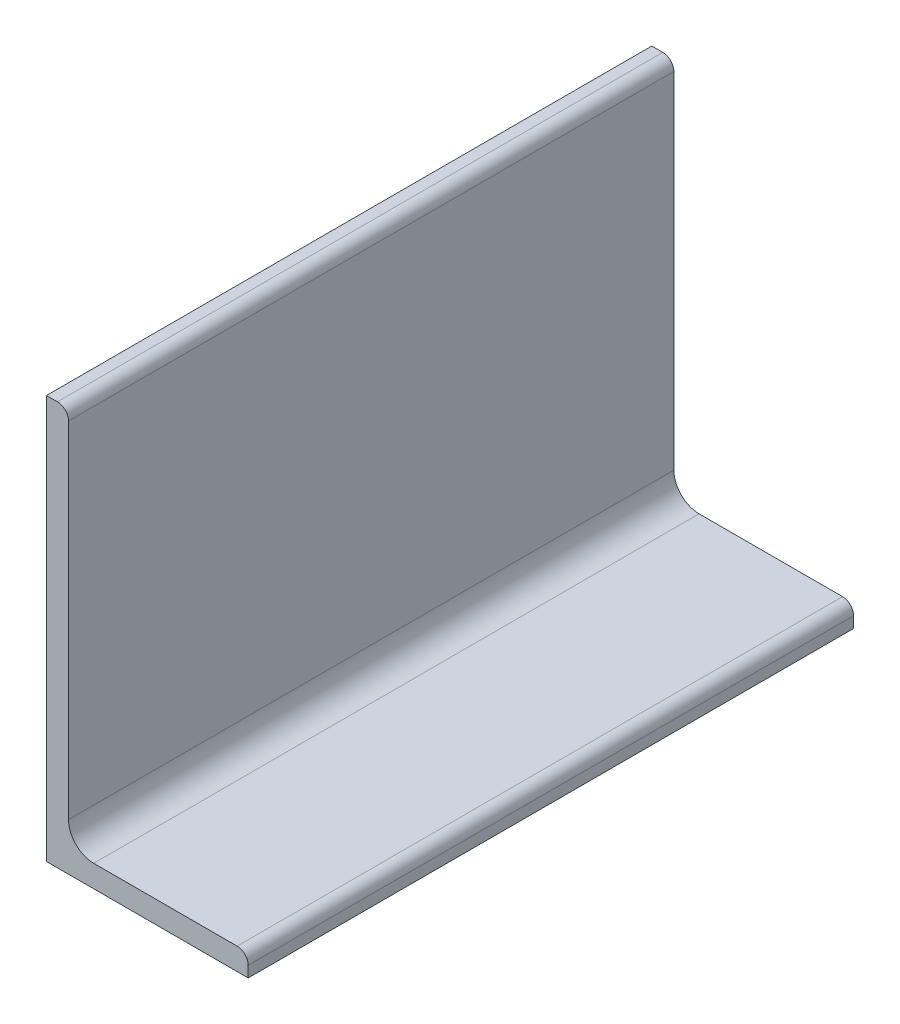
ISO-10303-21;
HEADER;
FILE_DESCRIPTION(('STEP AP214'),'2;1');
FILE_NAME('part.step','',(''),(''),'','','');
FILE_SCHEMA(('AUTOMOTIVE_DESIGN { 1 0 10303 214 1 1 1 1 }'));
ENDSEC;
DATA;
#1=APPLICATION_CONTEXT('core data for automotive mechanical design processes');
#2=APPLICATION_PROTOCOL_DEFINITION('international standard','automotive_design',2000,#1);
#3=PRODUCT_CONTEXT('',#1,'mechanical');
#4=PRODUCT('Part','Part','',(#3));
#5=PRODUCT_RELATED_PRODUCT_CATEGORY('part','',(#4));
#6=PRODUCT_DEFINITION_FORMATION('','',#4);
#7=PRODUCT_DEFINITION_CONTEXT('part definition',#1,'design');
#8=PRODUCT_DEFINITION('design','',#6,#7);
#9=PRODUCT_DEFINITION_SHAPE('','',#8);
#10=(LENGTH_UNIT() NAMED_UNIT(*) SI_UNIT(.MILLI.,.METRE.));
#11=(NAMED_UNIT(*) PLANE_ANGLE_UNIT() SI_UNIT($,.RADIAN.));
#12=(NAMED_UNIT(*) SI_UNIT($,.STERADIAN.) SOLID_ANGLE_UNIT());
#13=UNCERTAINTY_MEASURE_WITH_UNIT(LENGTH_MEASURE(1.E-05),#10,'distance_accuracy_value','');
#14=(GEOMETRIC_REPRESENTATION_CONTEXT(3) GLOBAL_UNCERTAINTY_ASSIGNED_CONTEXT((#13)) GLOBAL_UNIT_ASSIGNED_CONTEXT((#10,
#11,#12)) REPRESENTATION_CONTEXT('',''));
#15=CARTESIAN_POINT('',(0.,0.,0.));
#16=DIRECTION('',(0.,0.,1.));
#17=DIRECTION('',(1.,0.,0.));
#18=AXIS2_PLACEMENT_3D('',#15,#16,#17);
#19=CARTESIAN_POINT('',(0.865045893659089,203.678837479772,304.8));
#20=DIRECTION('',(1.,0.,0.));
#21=DIRECTION('',(0.,0.,-1.));
#22=AXIS2_PLACEMENT_3D('',#19,#20,#21);
#23=PLANE('',#22);
#24=DIRECTION('',(0.,-1.,0.));
#25=VECTOR('',#24,1.);
#26=CARTESIAN_POINT('',(0.865045893659089,203.678837479772,0.));
#27=LINE('',#26,#25);
#28=CARTESIAN_POINT('',(0.865045893659089,203.678837479772,0.));
#29=VERTEX_POINT('',#28);
#30=CARTESIAN_POINT('',(0.865045893659089,0.478837479771528,0.));
#31=VERTEX_POINT('',#30);
#32=EDGE_CURVE('E135',#29,#31,#27,.T.);
#33=ORIENTED_EDGE('',*,*,#32,.T.);
#34=DIRECTION('',(0.,0.,-1.));
#35=VECTOR('',#34,1.);
#36=CARTESIAN_POINT('',(0.865045893659089,0.478837479771528,304.8));
#37=LINE('',#36,#35);
#38=CARTESIAN_POINT('',(0.865045893659089,0.478837479771528,304.8));
#39=VERTEX_POINT('',#38);
#40=EDGE_CURVE('E11',#39,#31,#37,.T.);
#41=ORIENTED_EDGE('',*,*,#40,.F.);
#42=DIRECTION('',(0.,-1.,0.));
#43=VECTOR('',#42,1.);
#44=CARTESIAN_POINT('',(0.865045893659089,203.678837479772,304.8));
#45=LINE('',#44,#43);
#46=CARTESIAN_POINT('',(0.865045893659089,203.678837479772,304.8));
#47=VERTEX_POINT('',#46);
#48=EDGE_CURVE('E151',#47,#39,#45,.T.);
#49=ORIENTED_EDGE('',*,*,#48,.F.);
#50=DIRECTION('',(0.,0.,-1.));
#51=VECTOR('',#50,1.);
#52=CARTESIAN_POINT('',(0.865045893659089,203.678837479772,304.8));
#53=LINE('',#52,#51);
#54=EDGE_CURVE('E131',#47,#29,#53,.T.);
#55=ORIENTED_EDGE('',*,*,#54,.T.);
#56=EDGE_LOOP('',(#33,#41,#49,#55));
#57=FACE_BOUND('',#56,.T.);
#58=ADVANCED_FACE('F33',(#57),#23,.F.);
#59=CARTESIAN_POINT('',(0.865045893659089,0.478837479771528,304.8));
#60=DIRECTION('',(0.,1.,0.));
#61=DIRECTION('',(0.,0.,1.));
#62=AXIS2_PLACEMENT_3D('',#59,#60,#61);
#63=PLANE('',#62);
#64=DIRECTION('',(1.,0.,0.));
#65=VECTOR('',#64,1.);
#66=CARTESIAN_POINT('',(0.865045893659089,0.478837479771528,0.));
#67=LINE('',#66,#65);
#68=CARTESIAN_POINT('',(102.465045893659,0.478837479771528,0.));
#69=VERTEX_POINT('',#68);
#70=EDGE_CURVE('E138',#31,#69,#67,.T.);
#71=ORIENTED_EDGE('',*,*,#70,.T.);
#72=DIRECTION('',(0.,0.,-1.));
#73=VECTOR('',#72,1.);
#74=CARTESIAN_POINT('',(102.465045893659,0.478837479771528,304.8));
#75=LINE('',#74,#73);
#76=CARTESIAN_POINT('',(102.465045893659,0.478837479771528,304.8));
#77=VERTEX_POINT('',#76);
#78=EDGE_CURVE('E41',#77,#69,#75,.T.);
#79=ORIENTED_EDGE('',*,*,#78,.F.);
#80=DIRECTION('',(1.,0.,0.));
#81=VECTOR('',#80,1.);
#82=CARTESIAN_POINT('',(0.865045893659089,0.478837479771528,304.8));
#83=LINE('',#82,#81);
#84=EDGE_CURVE('E95',#39,#77,#83,.T.);
#85=ORIENTED_EDGE('',*,*,#84,.F.);
#86=ORIENTED_EDGE('',*,*,#40,.T.);
#87=EDGE_LOOP('',(#71,#79,#85,#86));
#88=FACE_BOUND('',#87,.T.);
#89=ADVANCED_FACE('F194',(#88),#63,.F.);
#90=CARTESIAN_POINT('',(102.465045893659,0.478837479771528,304.8));
#91=DIRECTION('',(-1.,0.,0.));
#92=DIRECTION('',(0.,0.,1.));
#93=AXIS2_PLACEMENT_3D('',#90,#91,#92);
#94=PLANE('',#93);
#95=DIRECTION('',(0.,1.,0.));
#96=VECTOR('',#95,1.);
#97=CARTESIAN_POINT('',(102.465045893659,0.478837479771528,0.));
#98=LINE('',#97,#96);
#99=CARTESIAN_POINT('',(102.465045893659,6.03508747977153,0.));
#100=VERTEX_POINT('',#99);
#101=EDGE_CURVE('E140',#69,#100,#98,.T.);
#102=ORIENTED_EDGE('',*,*,#101,.T.);
#103=DIRECTION('',(0.,0.,-1.));
#104=VECTOR('',#103,1.);
#105=CARTESIAN_POINT('',(102.465045893659,6.03508747977153,304.8));
#106=LINE('',#105,#104);
#107=CARTESIAN_POINT('',(102.465045893659,6.03508747977153,304.8));
#108=VERTEX_POINT('',#107);
#109=EDGE_CURVE('E161',#108,#100,#106,.T.);
#110=ORIENTED_EDGE('',*,*,#109,.F.);
#111=DIRECTION('',(0.,1.,0.));
#112=VECTOR('',#111,1.);
#113=CARTESIAN_POINT('',(102.465045893659,0.478837479771528,304.8));
#114=LINE('',#113,#112);
#115=EDGE_CURVE('E169',#77,#108,#114,.T.);
#116=ORIENTED_EDGE('',*,*,#115,.F.);
#117=ORIENTED_EDGE('',*,*,#78,.T.);
#118=EDGE_LOOP('',(#102,#110,#116,#117));
#119=FACE_BOUND('',#118,.T.);
#120=ADVANCED_FACE('F167',(#119),#94,.F.);
#121=CARTESIAN_POINT('',(96.9087958936591,6.03508747977153,304.8));
#122=DIRECTION('',(0.,0.,-1.));
#123=DIRECTION('',(-1.,0.,0.));
#124=AXIS2_PLACEMENT_3D('',#121,#122,#123);
#125=CYLINDRICAL_SURFACE('',#124,5.55625000000001);
#126=CARTESIAN_POINT('',(96.9087958936591,6.03508747977153,0.));
#127=DIRECTION('',(0.,0.,1.));
#128=DIRECTION('',(1.,0.,0.));
#129=AXIS2_PLACEMENT_3D('',#126,#127,#128);
#130=CIRCLE('',#129,5.55625000000001);
#131=CARTESIAN_POINT('',(96.9087958936591,11.5913374797715,0.));
#132=VERTEX_POINT('',#131);
#133=EDGE_CURVE('E142',#100,#132,#130,.T.);
#134=ORIENTED_EDGE('',*,*,#133,.T.);
#135=DIRECTION('',(0.,0.,-1.));
#136=VECTOR('',#135,1.);
#137=CARTESIAN_POINT('',(96.9087958936591,11.5913374797715,304.8));
#138=LINE('',#137,#136);
#139=CARTESIAN_POINT('',(96.9087958936591,11.5913374797715,304.8));
#140=VERTEX_POINT('',#139);
#141=EDGE_CURVE('E158',#140,#132,#138,.T.);
#142=ORIENTED_EDGE('',*,*,#141,.F.);
#143=CARTESIAN_POINT('',(96.9087958936591,6.03508747977153,304.8));
#144=DIRECTION('',(0.,0.,1.));
#145=DIRECTION('',(1.,0.,0.));
#146=AXIS2_PLACEMENT_3D('',#143,#144,#145);
#147=CIRCLE('',#146,5.55625000000001);
#148=EDGE_CURVE('E185',#108,#140,#147,.T.);
#149=ORIENTED_EDGE('',*,*,#148,.F.);
#150=ORIENTED_EDGE('',*,*,#109,.T.);
#151=EDGE_LOOP('',(#134,#142,#149,#150));
#152=FACE_BOUND('',#151,.T.);
#153=ADVANCED_FACE('F178',(#152),#125,.T.);
#154=CARTESIAN_POINT('',(96.9087958936591,11.5913374797715,304.8));
#155=DIRECTION('',(0.,-1.,0.));
#156=DIRECTION('',(0.,0.,-1.));
#157=AXIS2_PLACEMENT_3D('',#154,#155,#156);
#158=PLANE('',#157);
#159=DIRECTION('',(-1.,0.,0.));
#160=VECTOR('',#159,1.);
#161=CARTESIAN_POINT('',(96.9087958936591,11.5913374797715,0.));
#162=LINE('',#161,#160);
#163=CARTESIAN_POINT('',(24.6775458936591,11.5913374797715,0.));
#164=VERTEX_POINT('',#163);
#165=EDGE_CURVE('E144',#132,#164,#162,.T.);
#166=ORIENTED_EDGE('',*,*,#165,.T.);
#167=DIRECTION('',(0.,0.,-1.));
#168=VECTOR('',#167,1.);
#169=CARTESIAN_POINT('',(24.6775458936591,11.5913374797715,304.8));
#170=LINE('',#169,#168);
#171=CARTESIAN_POINT('',(24.6775458936591,11.5913374797715,304.8));
#172=VERTEX_POINT('',#171);
#173=EDGE_CURVE('E155',#172,#164,#170,.T.);
#174=ORIENTED_EDGE('',*,*,#173,.F.);
#175=DIRECTION('',(-1.,0.,0.));
#176=VECTOR('',#175,1.);
#177=CARTESIAN_POINT('',(96.9087958936591,11.5913374797715,304.8));
#178=LINE('',#177,#176);
#179=EDGE_CURVE('E184',#140,#172,#178,.T.);
#180=ORIENTED_EDGE('',*,*,#179,.F.);
#181=ORIENTED_EDGE('',*,*,#141,.T.);
#182=EDGE_LOOP('',(#166,#174,#180,#181));
#183=FACE_BOUND('',#182,.T.);
#184=ADVANCED_FACE('F182',(#183),#158,.F.);
#185=CARTESIAN_POINT('',(24.6775458936591,24.2913374797715,304.8));
#186=DIRECTION('',(0.,0.,-1.));
#187=DIRECTION('',(-1.,0.,0.));
#188=AXIS2_PLACEMENT_3D('',#185,#186,#187);
#189=CYLINDRICAL_SURFACE('',#188,12.7);
#190=CARTESIAN_POINT('',(24.6775458936591,24.2913374797715,0.));
#191=DIRECTION('',(0.,0.,-1.));
#192=DIRECTION('',(1.,0.,0.));
#193=AXIS2_PLACEMENT_3D('',#190,#191,#192);
#194=CIRCLE('',#193,12.7);
#195=CARTESIAN_POINT('',(11.9775458936591,24.2913374797715,0.));
#196=VERTEX_POINT('',#195);
#197=EDGE_CURVE('E146',#164,#196,#194,.T.);
#198=ORIENTED_EDGE('',*,*,#197,.T.);
#199=DIRECTION('',(0.,0.,-1.));
#200=VECTOR('',#199,1.);
#201=CARTESIAN_POINT('',(11.9775458936591,24.2913374797715,304.8));
#202=LINE('',#201,#200);
#203=CARTESIAN_POINT('',(11.9775458936591,24.2913374797715,304.8));
#204=VERTEX_POINT('',#203);
#205=EDGE_CURVE('E126',#204,#196,#202,.T.);
#206=ORIENTED_EDGE('',*,*,#205,.F.);
#207=CARTESIAN_POINT('',(24.6775458936591,24.2913374797715,304.8));
#208=DIRECTION('',(0.,0.,-1.));
#209=DIRECTION('',(1.,0.,0.));
#210=AXIS2_PLACEMENT_3D('',#207,#208,#209);
#211=CIRCLE('',#210,12.7);
#212=EDGE_CURVE('E117',#172,#204,#211,.T.);
#213=ORIENTED_EDGE('',*,*,#212,.F.);
#214=ORIENTED_EDGE('',*,*,#173,.T.);
#215=EDGE_LOOP('',(#198,#206,#213,#214));
#216=FACE_BOUND('',#215,.T.);
#217=ADVANCED_FACE('F206',(#216),#189,.F.);
#218=CARTESIAN_POINT('',(11.9775458936591,24.2913374797715,304.8));
#219=DIRECTION('',(-1.,0.,0.));
#220=DIRECTION('',(0.,0.,1.));
#221=AXIS2_PLACEMENT_3D('',#218,#219,#220);
#222=PLANE('',#221);
#223=DIRECTION('',(0.,1.,0.));
#224=VECTOR('',#223,1.);
#225=CARTESIAN_POINT('',(11.9775458936591,24.2913374797715,0.));
#226=LINE('',#225,#224);
#227=CARTESIAN_POINT('',(11.9775458936591,198.122587479772,0.));
#228=VERTEX_POINT('',#227);
#229=EDGE_CURVE('E125',#196,#228,#226,.T.);
#230=ORIENTED_EDGE('',*,*,#229,.T.);
#231=DIRECTION('',(0.,0.,-1.));
#232=VECTOR('',#231,1.);
#233=CARTESIAN_POINT('',(11.9775458936591,198.122587479772,304.8));
#234=LINE('',#233,#232);
#235=CARTESIAN_POINT('',(11.9775458936591,198.122587479772,304.8));
#236=VERTEX_POINT('',#235);
#237=EDGE_CURVE('E122',#236,#228,#234,.T.);
#238=ORIENTED_EDGE('',*,*,#237,.F.);
#239=DIRECTION('',(0.,1.,0.));
#240=VECTOR('',#239,1.);
#241=CARTESIAN_POINT('',(11.9775458936591,24.2913374797715,304.8));
#242=LINE('',#241,#240);
#243=EDGE_CURVE('E111',#204,#236,#242,.T.);
#244=ORIENTED_EDGE('',*,*,#243,.F.);
#245=ORIENTED_EDGE('',*,*,#205,.T.);
#246=EDGE_LOOP('',(#230,#238,#244,#245));
#247=FACE_BOUND('',#246,.T.);
#248=ADVANCED_FACE('F123',(#247),#222,.F.);
#249=CARTESIAN_POINT('',(6.42129589365908,198.122587479772,304.8));
#250=DIRECTION('',(0.,0.,-1.));
#251=DIRECTION('',(-1.,0.,0.));
#252=AXIS2_PLACEMENT_3D('',#249,#250,#251);
#253=CYLINDRICAL_SURFACE('',#252,5.55625);
#254=CARTESIAN_POINT('',(6.42129589365908,198.122587479772,0.));
#255=DIRECTION('',(0.,0.,1.));
#256=DIRECTION('',(1.,0.,0.));
#257=AXIS2_PLACEMENT_3D('',#254,#255,#256);
#258=CIRCLE('',#257,5.55625);
#259=CARTESIAN_POINT('',(6.42129589365909,203.678837479772,0.));
#260=VERTEX_POINT('',#259);
#261=EDGE_CURVE('E81',#228,#260,#258,.T.);
#262=ORIENTED_EDGE('',*,*,#261,.T.);
#263=DIRECTION('',(0.,0.,-1.));
#264=VECTOR('',#263,1.);
#265=CARTESIAN_POINT('',(6.42129589365909,203.678837479772,304.8));
#266=LINE('',#265,#264);
#267=CARTESIAN_POINT('',(6.42129589365909,203.678837479772,304.8));
#268=VERTEX_POINT('',#267);
#269=EDGE_CURVE('E127',#268,#260,#266,.T.);
#270=ORIENTED_EDGE('',*,*,#269,.F.);
#271=CARTESIAN_POINT('',(6.42129589365908,198.122587479772,304.8));
#272=DIRECTION('',(0.,0.,1.));
#273=DIRECTION('',(1.,0.,0.));
#274=AXIS2_PLACEMENT_3D('',#271,#272,#273);
#275=CIRCLE('',#274,5.55625);
#276=EDGE_CURVE('E115',#236,#268,#275,.T.);
#277=ORIENTED_EDGE('',*,*,#276,.F.);
#278=ORIENTED_EDGE('',*,*,#237,.T.);
#279=EDGE_LOOP('',(#262,#270,#277,#278));
#280=FACE_BOUND('',#279,.T.);
#281=ADVANCED_FACE('F129',(#280),#253,.T.);
#282=CARTESIAN_POINT('',(6.42129589365909,203.678837479772,304.8));
#283=DIRECTION('',(0.,-1.,0.));
#284=DIRECTION('',(0.,0.,-1.));
#285=AXIS2_PLACEMENT_3D('',#282,#283,#284);
#286=PLANE('',#285);
#287=DIRECTION('',(-1.,0.,0.));
#288=VECTOR('',#287,1.);
#289=CARTESIAN_POINT('',(6.42129589365909,203.678837479772,0.));
#290=LINE('',#289,#288);
#291=EDGE_CURVE('E87',#260,#29,#290,.T.);
#292=ORIENTED_EDGE('',*,*,#291,.T.);
#293=ORIENTED_EDGE('',*,*,#54,.F.);
#294=DIRECTION('',(-1.,0.,0.));
#295=VECTOR('',#294,1.);
#296=CARTESIAN_POINT('',(6.42129589365909,203.678837479772,304.8));
#297=LINE('',#296,#295);
#298=EDGE_CURVE('E49',#268,#47,#297,.T.);
#299=ORIENTED_EDGE('',*,*,#298,.F.);
#300=ORIENTED_EDGE('',*,*,#269,.T.);
#301=EDGE_LOOP('',(#292,#293,#299,#300));
#302=FACE_BOUND('',#301,.T.);
#303=ADVANCED_FACE('F214',(#302),#286,.F.);
#304=CARTESIAN_POINT('',(96.9087958936591,6.03508747977153,304.8));
#305=DIRECTION('',(0.,0.,1.));
#306=DIRECTION('',(1.,0.,0.));
#307=AXIS2_PLACEMENT_3D('',#304,#305,#306);
#308=PLANE('',#307);
#309=ORIENTED_EDGE('',*,*,#48,.T.);
#310=ORIENTED_EDGE('',*,*,#84,.T.);
#311=ORIENTED_EDGE('',*,*,#115,.T.);
#312=ORIENTED_EDGE('',*,*,#148,.T.);
#313=ORIENTED_EDGE('',*,*,#179,.T.);
#314=ORIENTED_EDGE('',*,*,#212,.T.);
#315=ORIENTED_EDGE('',*,*,#243,.T.);
#316=ORIENTED_EDGE('',*,*,#276,.T.);
#317=ORIENTED_EDGE('',*,*,#298,.T.);
#318=EDGE_LOOP('',(#309,#310,#311,#312,#313,#314,#315,#316,#317));
#319=FACE_BOUND('',#318,.T.);
#320=ADVANCED_FACE('F113',(#319),#308,.T.);
#321=CARTESIAN_POINT('',(96.9087958936591,6.03508747977153,0.));
#322=DIRECTION('',(0.,0.,1.));
#323=DIRECTION('',(1.,0.,0.));
#324=AXIS2_PLACEMENT_3D('',#321,#322,#323);
#325=PLANE('',#324);
#326=ORIENTED_EDGE('',*,*,#32,.F.);
#327=ORIENTED_EDGE('',*,*,#291,.F.);
#328=ORIENTED_EDGE('',*,*,#261,.F.);
#329=ORIENTED_EDGE('',*,*,#229,.F.);
#330=ORIENTED_EDGE('',*,*,#197,.F.);
#331=ORIENTED_EDGE('',*,*,#165,.F.);
#332=ORIENTED_EDGE('',*,*,#133,.F.);
#333=ORIENTED_EDGE('',*,*,#101,.F.);
#334=ORIENTED_EDGE('',*,*,#70,.F.);
#335=EDGE_LOOP('',(#326,#327,#328,#329,#330,#331,#332,#333,#334));
#336=FACE_BOUND('',#335,.T.);
#337=ADVANCED_FACE('F173',(#336),#325,.F.);
#338=CLOSED_SHELL('',(#58,#89,#120,#153,#184,#217,#248,#281,#303,#320,#337));
#339=MANIFOLD_SOLID_BREP('B2',#338);
#340=ADVANCED_BREP_SHAPE_REPRESENTATION('',(#18,#339),#14);
#341=SHAPE_DEFINITION_REPRESENTATION(#9,#340);
ENDSEC;
END-ISO-10303-21;
